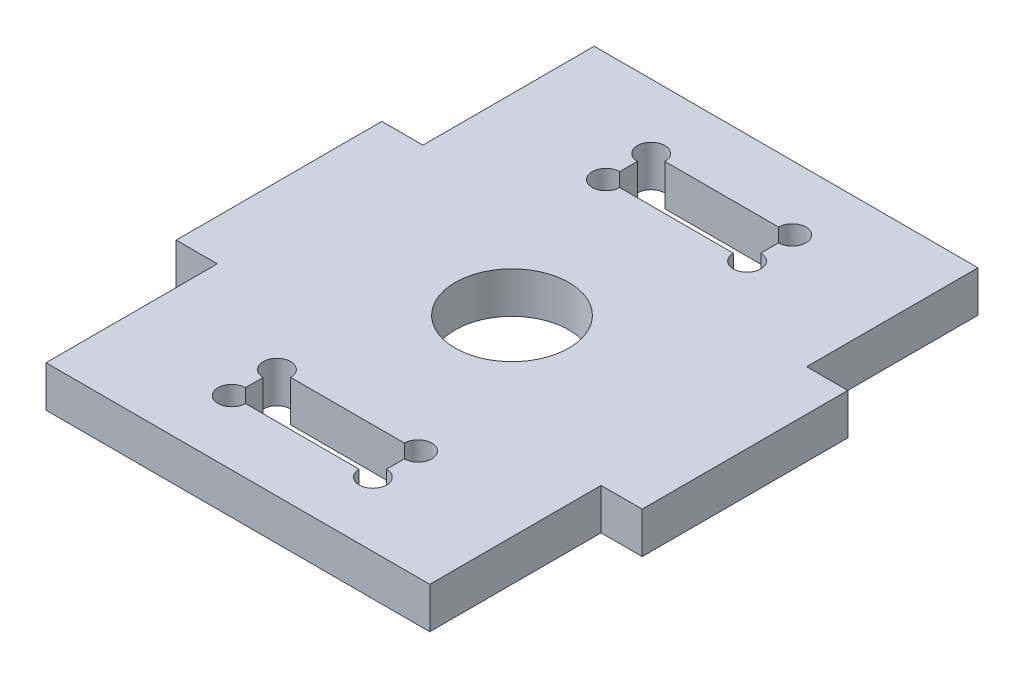
ISO-10303-21;
HEADER;
FILE_DESCRIPTION(('STEP AP214'),'2;1');
FILE_NAME('part.step','',(''),(''),'','','');
FILE_SCHEMA(('AUTOMOTIVE_DESIGN { 1 0 10303 214 1 1 1 1 }'));
ENDSEC;
DATA;
#1=APPLICATION_CONTEXT('core data for automotive mechanical design processes');
#2=APPLICATION_PROTOCOL_DEFINITION('international standard','automotive_design',2000,#1);
#3=PRODUCT_CONTEXT('',#1,'mechanical');
#4=PRODUCT('Part','Part','',(#3));
#5=PRODUCT_RELATED_PRODUCT_CATEGORY('part','',(#4));
#6=PRODUCT_DEFINITION_FORMATION('','',#4);
#7=PRODUCT_DEFINITION_CONTEXT('part definition',#1,'design');
#8=PRODUCT_DEFINITION('design','',#6,#7);
#9=PRODUCT_DEFINITION_SHAPE('','',#8);
#10=(LENGTH_UNIT() NAMED_UNIT(*) SI_UNIT(.MILLI.,.METRE.));
#11=(NAMED_UNIT(*) PLANE_ANGLE_UNIT() SI_UNIT($,.RADIAN.));
#12=(NAMED_UNIT(*) SI_UNIT($,.STERADIAN.) SOLID_ANGLE_UNIT());
#13=UNCERTAINTY_MEASURE_WITH_UNIT(LENGTH_MEASURE(1.E-05),#10,'distance_accuracy_value','');
#14=(GEOMETRIC_REPRESENTATION_CONTEXT(3) GLOBAL_UNCERTAINTY_ASSIGNED_CONTEXT((#13)) GLOBAL_UNIT_ASSIGNED_CONTEXT((#10,
#11,#12)) REPRESENTATION_CONTEXT('',''));
#15=CARTESIAN_POINT('',(0.,0.,0.));
#16=DIRECTION('',(0.,0.,1.));
#17=DIRECTION('',(1.,0.,0.));
#18=AXIS2_PLACEMENT_3D('',#15,#16,#17);
#19=CARTESIAN_POINT('',(0.,3.,15.3));
#20=DIRECTION('',(0.,0.,-1.));
#21=DIRECTION('',(-1.,0.,0.));
#22=AXIS2_PLACEMENT_3D('',#19,#20,#21);
#23=PLANE('',#22);
#24=DIRECTION('',(1.,0.,0.));
#25=VECTOR('',#24,1.);
#26=CARTESIAN_POINT('',(0.,0.,15.3));
#27=LINE('',#26,#25);
#28=CARTESIAN_POINT('',(-4.15,0.,15.3));
#29=VERTEX_POINT('',#28);
#30=CARTESIAN_POINT('',(4.15,0.,15.3));
#31=VERTEX_POINT('',#30);
#32=EDGE_CURVE('E343',#29,#31,#27,.T.);
#33=ORIENTED_EDGE('',*,*,#32,.F.);
#34=DIRECTION('',(0.,-1.,0.));
#35=VECTOR('',#34,1.);
#36=CARTESIAN_POINT('',(-4.15,3.,15.3));
#37=LINE('',#36,#35);
#38=CARTESIAN_POINT('',(-4.15,3.,15.3));
#39=VERTEX_POINT('',#38);
#40=EDGE_CURVE('E12',#39,#29,#37,.T.);
#41=ORIENTED_EDGE('',*,*,#40,.F.);
#42=DIRECTION('',(1.,0.,0.));
#43=VECTOR('',#42,1.);
#44=CARTESIAN_POINT('',(0.,3.,15.3));
#45=LINE('',#44,#43);
#46=CARTESIAN_POINT('',(4.15,3.,15.3));
#47=VERTEX_POINT('',#46);
#48=EDGE_CURVE('E555',#39,#47,#45,.T.);
#49=ORIENTED_EDGE('',*,*,#48,.T.);
#50=DIRECTION('',(0.,-1.,0.));
#51=VECTOR('',#50,1.);
#52=CARTESIAN_POINT('',(4.15,3.,15.3));
#53=LINE('',#52,#51);
#54=EDGE_CURVE('E162',#47,#31,#53,.T.);
#55=ORIENTED_EDGE('',*,*,#54,.T.);
#56=EDGE_LOOP('',(#33,#41,#49,#55));
#57=FACE_BOUND('',#56,.T.);
#58=ADVANCED_FACE('F48',(#57),#23,.T.);
#59=CARTESIAN_POINT('',(-5.15,3.,15.3));
#60=DIRECTION('',(0.,-1.,0.));
#61=DIRECTION('',(0.,0.,-1.));
#62=AXIS2_PLACEMENT_3D('',#59,#60,#61);
#63=CYLINDRICAL_SURFACE('',#62,1.);
#64=CARTESIAN_POINT('',(-5.15,0.,15.3));
#65=DIRECTION('',(0.,1.,0.));
#66=DIRECTION('',(0.,0.,1.));
#67=AXIS2_PLACEMENT_3D('',#64,#65,#66);
#68=CIRCLE('',#67,1.);
#69=CARTESIAN_POINT('',(-5.15,0.,14.3));
#70=VERTEX_POINT('',#69);
#71=EDGE_CURVE('E348',#29,#70,#68,.F.);
#72=ORIENTED_EDGE('',*,*,#71,.T.);
#73=DIRECTION('',(0.,-1.,0.));
#74=VECTOR('',#73,1.);
#75=CARTESIAN_POINT('',(-5.15,3.,14.3));
#76=LINE('',#75,#74);
#77=CARTESIAN_POINT('',(-5.15,3.,14.3));
#78=VERTEX_POINT('',#77);
#79=EDGE_CURVE('E59',#78,#70,#76,.T.);
#80=ORIENTED_EDGE('',*,*,#79,.F.);
#81=CARTESIAN_POINT('',(-5.15,3.,15.3));
#82=DIRECTION('',(0.,1.,0.));
#83=DIRECTION('',(0.,0.,1.));
#84=AXIS2_PLACEMENT_3D('',#81,#82,#83);
#85=CIRCLE('',#84,1.);
#86=EDGE_CURVE('E558',#39,#78,#85,.F.);
#87=ORIENTED_EDGE('',*,*,#86,.F.);
#88=ORIENTED_EDGE('',*,*,#40,.T.);
#89=EDGE_LOOP('',(#72,#80,#87,#88));
#90=FACE_BOUND('',#89,.T.);
#91=ADVANCED_FACE('F656',(#90),#63,.F.);
#92=CARTESIAN_POINT('',(-5.15,3.,0.));
#93=DIRECTION('',(-1.,0.,0.));
#94=DIRECTION('',(0.,0.,1.));
#95=AXIS2_PLACEMENT_3D('',#92,#93,#94);
#96=PLANE('',#95);
#97=DIRECTION('',(0.,0.,-1.));
#98=VECTOR('',#97,1.);
#99=CARTESIAN_POINT('',(-5.15,0.,0.));
#100=LINE('',#99,#98);
#101=CARTESIAN_POINT('',(-5.15,0.,13.));
#102=VERTEX_POINT('',#101);
#103=EDGE_CURVE('E995',#70,#102,#100,.T.);
#104=ORIENTED_EDGE('',*,*,#103,.T.);
#105=DIRECTION('',(0.,-1.,0.));
#106=VECTOR('',#105,1.);
#107=CARTESIAN_POINT('',(-5.15,3.,13.));
#108=LINE('',#107,#106);
#109=CARTESIAN_POINT('',(-5.15,3.,13.));
#110=VERTEX_POINT('',#109);
#111=EDGE_CURVE('E375',#110,#102,#108,.T.);
#112=ORIENTED_EDGE('',*,*,#111,.F.);
#113=DIRECTION('',(0.,0.,-1.));
#114=VECTOR('',#113,1.);
#115=CARTESIAN_POINT('',(-5.15,3.,0.));
#116=LINE('',#115,#114);
#117=EDGE_CURVE('E562',#78,#110,#116,.T.);
#118=ORIENTED_EDGE('',*,*,#117,.F.);
#119=ORIENTED_EDGE('',*,*,#79,.T.);
#120=EDGE_LOOP('',(#104,#112,#118,#119));
#121=FACE_BOUND('',#120,.T.);
#122=ADVANCED_FACE('F661',(#121),#96,.F.);
#123=CARTESIAN_POINT('',(-5.15,3.,12.));
#124=DIRECTION('',(0.,-1.,0.));
#125=DIRECTION('',(0.,0.,-1.));
#126=AXIS2_PLACEMENT_3D('',#123,#124,#125);
#127=CYLINDRICAL_SURFACE('',#126,1.);
#128=CARTESIAN_POINT('',(-5.15,0.,12.));
#129=DIRECTION('',(0.,1.,0.));
#130=DIRECTION('',(0.,0.,1.));
#131=AXIS2_PLACEMENT_3D('',#128,#129,#130);
#132=CIRCLE('',#131,1.);
#133=CARTESIAN_POINT('',(-4.15,0.,12.));
#134=VERTEX_POINT('',#133);
#135=EDGE_CURVE('E1000',#102,#134,#132,.F.);
#136=ORIENTED_EDGE('',*,*,#135,.T.);
#137=DIRECTION('',(0.,-1.,0.));
#138=VECTOR('',#137,1.);
#139=CARTESIAN_POINT('',(-4.15,3.,12.));
#140=LINE('',#139,#138);
#141=CARTESIAN_POINT('',(-4.15,3.,12.));
#142=VERTEX_POINT('',#141);
#143=EDGE_CURVE('E371',#142,#134,#140,.T.);
#144=ORIENTED_EDGE('',*,*,#143,.F.);
#145=CARTESIAN_POINT('',(-5.15,3.,12.));
#146=DIRECTION('',(0.,1.,0.));
#147=DIRECTION('',(0.,0.,1.));
#148=AXIS2_PLACEMENT_3D('',#145,#146,#147);
#149=CIRCLE('',#148,1.);
#150=EDGE_CURVE('E566',#110,#142,#149,.F.);
#151=ORIENTED_EDGE('',*,*,#150,.F.);
#152=ORIENTED_EDGE('',*,*,#111,.T.);
#153=EDGE_LOOP('',(#136,#144,#151,#152));
#154=FACE_BOUND('',#153,.T.);
#155=ADVANCED_FACE('F931',(#154),#127,.F.);
#156=CARTESIAN_POINT('',(0.,3.,12.));
#157=DIRECTION('',(0.,0.,-1.));
#158=DIRECTION('',(-1.,0.,0.));
#159=AXIS2_PLACEMENT_3D('',#156,#157,#158);
#160=PLANE('',#159);
#161=DIRECTION('',(1.,0.,0.));
#162=VECTOR('',#161,1.);
#163=CARTESIAN_POINT('',(0.,0.,12.));
#164=LINE('',#163,#162);
#165=CARTESIAN_POINT('',(4.15,0.,12.));
#166=VERTEX_POINT('',#165);
#167=EDGE_CURVE('E1004',#134,#166,#164,.T.);
#168=ORIENTED_EDGE('',*,*,#167,.T.);
#169=DIRECTION('',(0.,-1.,0.));
#170=VECTOR('',#169,1.);
#171=CARTESIAN_POINT('',(4.15,3.,12.));
#172=LINE('',#171,#170);
#173=CARTESIAN_POINT('',(4.15,3.,12.));
#174=VERTEX_POINT('',#173);
#175=EDGE_CURVE('E263',#174,#166,#172,.T.);
#176=ORIENTED_EDGE('',*,*,#175,.F.);
#177=DIRECTION('',(1.,0.,0.));
#178=VECTOR('',#177,1.);
#179=CARTESIAN_POINT('',(0.,3.,12.));
#180=LINE('',#179,#178);
#181=EDGE_CURVE('E249',#142,#174,#180,.T.);
#182=ORIENTED_EDGE('',*,*,#181,.F.);
#183=ORIENTED_EDGE('',*,*,#143,.T.);
#184=EDGE_LOOP('',(#168,#176,#182,#183));
#185=FACE_BOUND('',#184,.T.);
#186=ADVANCED_FACE('F921',(#185),#160,.F.);
#187=CARTESIAN_POINT('',(5.15,3.,12.));
#188=DIRECTION('',(0.,-1.,0.));
#189=DIRECTION('',(0.,0.,-1.));
#190=AXIS2_PLACEMENT_3D('',#187,#188,#189);
#191=CYLINDRICAL_SURFACE('',#190,1.);
#192=CARTESIAN_POINT('',(5.15,0.,12.));
#193=DIRECTION('',(0.,1.,0.));
#194=DIRECTION('',(0.,0.,1.));
#195=AXIS2_PLACEMENT_3D('',#192,#193,#194);
#196=CIRCLE('',#195,1.);
#197=CARTESIAN_POINT('',(5.15,0.,13.));
#198=VERTEX_POINT('',#197);
#199=EDGE_CURVE('E258',#166,#198,#196,.F.);
#200=ORIENTED_EDGE('',*,*,#199,.T.);
#201=DIRECTION('',(0.,-1.,0.));
#202=VECTOR('',#201,1.);
#203=CARTESIAN_POINT('',(5.15,3.,13.));
#204=LINE('',#203,#202);
#205=CARTESIAN_POINT('',(5.15,3.,13.));
#206=VERTEX_POINT('',#205);
#207=EDGE_CURVE('E256',#206,#198,#204,.T.);
#208=ORIENTED_EDGE('',*,*,#207,.F.);
#209=CARTESIAN_POINT('',(5.15,3.,12.));
#210=DIRECTION('',(0.,1.,0.));
#211=DIRECTION('',(0.,0.,1.));
#212=AXIS2_PLACEMENT_3D('',#209,#210,#211);
#213=CIRCLE('',#212,1.);
#214=EDGE_CURVE('E243',#174,#206,#213,.F.);
#215=ORIENTED_EDGE('',*,*,#214,.F.);
#216=ORIENTED_EDGE('',*,*,#175,.T.);
#217=EDGE_LOOP('',(#200,#208,#215,#216));
#218=FACE_BOUND('',#217,.T.);
#219=ADVANCED_FACE('F257',(#218),#191,.F.);
#220=CARTESIAN_POINT('',(5.15,3.,0.));
#221=DIRECTION('',(-1.,0.,0.));
#222=DIRECTION('',(0.,0.,1.));
#223=AXIS2_PLACEMENT_3D('',#220,#221,#222);
#224=PLANE('',#223);
#225=DIRECTION('',(0.,0.,-1.));
#226=VECTOR('',#225,1.);
#227=CARTESIAN_POINT('',(5.15,0.,0.));
#228=LINE('',#227,#226);
#229=CARTESIAN_POINT('',(5.15,0.,14.3));
#230=VERTEX_POINT('',#229);
#231=EDGE_CURVE('E355',#230,#198,#228,.T.);
#232=ORIENTED_EDGE('',*,*,#231,.F.);
#233=DIRECTION('',(0.,-1.,0.));
#234=VECTOR('',#233,1.);
#235=CARTESIAN_POINT('',(5.15,3.,14.3));
#236=LINE('',#235,#234);
#237=CARTESIAN_POINT('',(5.15,3.,14.3));
#238=VERTEX_POINT('',#237);
#239=EDGE_CURVE('E155',#238,#230,#236,.T.);
#240=ORIENTED_EDGE('',*,*,#239,.F.);
#241=DIRECTION('',(0.,0.,-1.));
#242=VECTOR('',#241,1.);
#243=CARTESIAN_POINT('',(5.15,3.,0.));
#244=LINE('',#243,#242);
#245=EDGE_CURVE('E247',#238,#206,#244,.T.);
#246=ORIENTED_EDGE('',*,*,#245,.T.);
#247=ORIENTED_EDGE('',*,*,#207,.T.);
#248=EDGE_LOOP('',(#232,#240,#246,#247));
#249=FACE_BOUND('',#248,.T.);
#250=ADVANCED_FACE('F265',(#249),#224,.T.);
#251=CARTESIAN_POINT('',(14.,3.,0.));
#252=DIRECTION('',(1.,0.,0.));
#253=DIRECTION('',(0.,0.,-1.));
#254=AXIS2_PLACEMENT_3D('',#251,#252,#253);
#255=PLANE('',#254);
#256=DIRECTION('',(0.,0.,1.));
#257=VECTOR('',#256,1.);
#258=CARTESIAN_POINT('',(14.,0.,0.));
#259=LINE('',#258,#257);
#260=CARTESIAN_POINT('',(14.,0.,-20.));
#261=VERTEX_POINT('',#260);
#262=CARTESIAN_POINT('',(14.,0.,-7.5));
#263=VERTEX_POINT('',#262);
#264=EDGE_CURVE('E295',#261,#263,#259,.T.);
#265=ORIENTED_EDGE('',*,*,#264,.F.);
#266=DIRECTION('',(0.,-1.,0.));
#267=VECTOR('',#266,1.);
#268=CARTESIAN_POINT('',(14.,3.,-20.));
#269=LINE('',#268,#267);
#270=CARTESIAN_POINT('',(14.,3.,-20.));
#271=VERTEX_POINT('',#270);
#272=EDGE_CURVE('E366',#271,#261,#269,.T.);
#273=ORIENTED_EDGE('',*,*,#272,.F.);
#274=DIRECTION('',(0.,0.,1.));
#275=VECTOR('',#274,1.);
#276=CARTESIAN_POINT('',(14.,3.,0.));
#277=LINE('',#276,#275);
#278=CARTESIAN_POINT('',(14.,3.,-7.5));
#279=VERTEX_POINT('',#278);
#280=EDGE_CURVE('E516',#271,#279,#277,.T.);
#281=ORIENTED_EDGE('',*,*,#280,.T.);
#282=DIRECTION('',(0.,-1.,0.));
#283=VECTOR('',#282,1.);
#284=CARTESIAN_POINT('',(14.,3.,-7.5));
#285=LINE('',#284,#283);
#286=EDGE_CURVE('E382',#279,#263,#285,.T.);
#287=ORIENTED_EDGE('',*,*,#286,.T.);
#288=EDGE_LOOP('',(#265,#273,#281,#287));
#289=FACE_BOUND('',#288,.T.);
#290=ADVANCED_FACE('F643',(#289),#255,.T.);
#291=CARTESIAN_POINT('',(0.,3.,-20.));
#292=DIRECTION('',(0.,0.,-1.));
#293=DIRECTION('',(-1.,0.,0.));
#294=AXIS2_PLACEMENT_3D('',#291,#292,#293);
#295=PLANE('',#294);
#296=DIRECTION('',(1.,0.,0.));
#297=VECTOR('',#296,1.);
#298=CARTESIAN_POINT('',(0.,0.,-20.));
#299=LINE('',#298,#297);
#300=CARTESIAN_POINT('',(-14.,0.,-20.));
#301=VERTEX_POINT('',#300);
#302=EDGE_CURVE('E303',#301,#261,#299,.T.);
#303=ORIENTED_EDGE('',*,*,#302,.F.);
#304=DIRECTION('',(0.,-1.,0.));
#305=VECTOR('',#304,1.);
#306=CARTESIAN_POINT('',(-14.,3.,-20.));
#307=LINE('',#306,#305);
#308=CARTESIAN_POINT('',(-14.,3.,-20.));
#309=VERTEX_POINT('',#308);
#310=EDGE_CURVE('E415',#309,#301,#307,.T.);
#311=ORIENTED_EDGE('',*,*,#310,.F.);
#312=DIRECTION('',(1.,0.,0.));
#313=VECTOR('',#312,1.);
#314=CARTESIAN_POINT('',(0.,3.,-20.));
#315=LINE('',#314,#313);
#316=EDGE_CURVE('E520',#309,#271,#315,.T.);
#317=ORIENTED_EDGE('',*,*,#316,.T.);
#318=ORIENTED_EDGE('',*,*,#272,.T.);
#319=EDGE_LOOP('',(#303,#311,#317,#318));
#320=FACE_BOUND('',#319,.T.);
#321=ADVANCED_FACE('F606',(#320),#295,.T.);
#322=CARTESIAN_POINT('',(-14.,3.,0.));
#323=DIRECTION('',(1.,0.,0.));
#324=DIRECTION('',(0.,0.,-1.));
#325=AXIS2_PLACEMENT_3D('',#322,#323,#324);
#326=PLANE('',#325);
#327=DIRECTION('',(0.,0.,1.));
#328=VECTOR('',#327,1.);
#329=CARTESIAN_POINT('',(-14.,0.,0.));
#330=LINE('',#329,#328);
#331=CARTESIAN_POINT('',(-14.,0.,-7.5));
#332=VERTEX_POINT('',#331);
#333=EDGE_CURVE('E631',#301,#332,#330,.T.);
#334=ORIENTED_EDGE('',*,*,#333,.T.);
#335=DIRECTION('',(0.,-1.,0.));
#336=VECTOR('',#335,1.);
#337=CARTESIAN_POINT('',(-14.,3.,-7.5));
#338=LINE('',#337,#336);
#339=CARTESIAN_POINT('',(-14.,3.,-7.5));
#340=VERTEX_POINT('',#339);
#341=EDGE_CURVE('E411',#340,#332,#338,.T.);
#342=ORIENTED_EDGE('',*,*,#341,.F.);
#343=DIRECTION('',(0.,0.,1.));
#344=VECTOR('',#343,1.);
#345=CARTESIAN_POINT('',(-14.,3.,0.));
#346=LINE('',#345,#344);
#347=EDGE_CURVE('E525',#309,#340,#346,.T.);
#348=ORIENTED_EDGE('',*,*,#347,.F.);
#349=ORIENTED_EDGE('',*,*,#310,.T.);
#350=EDGE_LOOP('',(#334,#342,#348,#349));
#351=FACE_BOUND('',#350,.T.);
#352=ADVANCED_FACE('F614',(#351),#326,.F.);
#353=CARTESIAN_POINT('',(0.,3.,-7.5));
#354=DIRECTION('',(0.,0.,1.));
#355=DIRECTION('',(1.,0.,0.));
#356=AXIS2_PLACEMENT_3D('',#353,#354,#355);
#357=PLANE('',#356);
#358=DIRECTION('',(-1.,0.,0.));
#359=VECTOR('',#358,1.);
#360=CARTESIAN_POINT('',(0.,0.,-7.5));
#361=LINE('',#360,#359);
#362=CARTESIAN_POINT('',(-17.,0.,-7.5));
#363=VERTEX_POINT('',#362);
#364=EDGE_CURVE('E619',#332,#363,#361,.T.);
#365=ORIENTED_EDGE('',*,*,#364,.T.);
#366=DIRECTION('',(0.,-1.,0.));
#367=VECTOR('',#366,1.);
#368=CARTESIAN_POINT('',(-17.,3.,-7.5));
#369=LINE('',#368,#367);
#370=CARTESIAN_POINT('',(-17.,3.,-7.5));
#371=VERTEX_POINT('',#370);
#372=EDGE_CURVE('E408',#371,#363,#369,.T.);
#373=ORIENTED_EDGE('',*,*,#372,.F.);
#374=DIRECTION('',(-1.,0.,0.));
#375=VECTOR('',#374,1.);
#376=CARTESIAN_POINT('',(0.,3.,-7.5));
#377=LINE('',#376,#375);
#378=EDGE_CURVE('E529',#340,#371,#377,.T.);
#379=ORIENTED_EDGE('',*,*,#378,.F.);
#380=ORIENTED_EDGE('',*,*,#341,.T.);
#381=EDGE_LOOP('',(#365,#373,#379,#380));
#382=FACE_BOUND('',#381,.T.);
#383=ADVANCED_FACE('F618',(#382),#357,.F.);
#384=CARTESIAN_POINT('',(-17.,3.,0.));
#385=DIRECTION('',(-1.,0.,0.));
#386=DIRECTION('',(0.,0.,1.));
#387=AXIS2_PLACEMENT_3D('',#384,#385,#386);
#388=PLANE('',#387);
#389=DIRECTION('',(0.,0.,-1.));
#390=VECTOR('',#389,1.);
#391=CARTESIAN_POINT('',(-17.,0.,0.));
#392=LINE('',#391,#390);
#393=CARTESIAN_POINT('',(-17.,0.,7.5));
#394=VERTEX_POINT('',#393);
#395=EDGE_CURVE('E624',#394,#363,#392,.T.);
#396=ORIENTED_EDGE('',*,*,#395,.F.);
#397=DIRECTION('',(0.,-1.,0.));
#398=VECTOR('',#397,1.);
#399=CARTESIAN_POINT('',(-17.,3.,7.5));
#400=LINE('',#399,#398);
#401=CARTESIAN_POINT('',(-17.,3.,7.5));
#402=VERTEX_POINT('',#401);
#403=EDGE_CURVE('E405',#402,#394,#400,.T.);
#404=ORIENTED_EDGE('',*,*,#403,.F.);
#405=DIRECTION('',(0.,0.,-1.));
#406=VECTOR('',#405,1.);
#407=CARTESIAN_POINT('',(-17.,3.,0.));
#408=LINE('',#407,#406);
#409=EDGE_CURVE('E533',#402,#371,#408,.T.);
#410=ORIENTED_EDGE('',*,*,#409,.T.);
#411=ORIENTED_EDGE('',*,*,#372,.T.);
#412=EDGE_LOOP('',(#396,#404,#410,#411));
#413=FACE_BOUND('',#412,.T.);
#414=ADVANCED_FACE('F623',(#413),#388,.T.);
#415=CARTESIAN_POINT('',(0.,3.,7.49999999999999));
#416=DIRECTION('',(0.,0.,1.));
#417=DIRECTION('',(1.,0.,0.));
#418=AXIS2_PLACEMENT_3D('',#415,#416,#417);
#419=PLANE('',#418);
#420=DIRECTION('',(-1.,0.,0.));
#421=VECTOR('',#420,1.);
#422=CARTESIAN_POINT('',(0.,0.,7.49999999999999));
#423=LINE('',#422,#421);
#424=CARTESIAN_POINT('',(-14.,0.,7.5));
#425=VERTEX_POINT('',#424);
#426=EDGE_CURVE('E325',#425,#394,#423,.T.);
#427=ORIENTED_EDGE('',*,*,#426,.F.);
#428=DIRECTION('',(0.,-1.,0.));
#429=VECTOR('',#428,1.);
#430=CARTESIAN_POINT('',(-14.,3.,7.5));
#431=LINE('',#430,#429);
#432=CARTESIAN_POINT('',(-14.,3.,7.5));
#433=VERTEX_POINT('',#432);
#434=EDGE_CURVE('E402',#433,#425,#431,.T.);
#435=ORIENTED_EDGE('',*,*,#434,.F.);
#436=DIRECTION('',(-1.,0.,0.));
#437=VECTOR('',#436,1.);
#438=CARTESIAN_POINT('',(0.,3.,7.49999999999999));
#439=LINE('',#438,#437);
#440=EDGE_CURVE('E537',#433,#402,#439,.T.);
#441=ORIENTED_EDGE('',*,*,#440,.T.);
#442=ORIENTED_EDGE('',*,*,#403,.T.);
#443=EDGE_LOOP('',(#427,#435,#441,#442));
#444=FACE_BOUND('',#443,.T.);
#445=ADVANCED_FACE('F628',(#444),#419,.T.);
#446=CARTESIAN_POINT('',(-14.,0.,20.));
#447=VERTEX_POINT('',#446);
#448=EDGE_CURVE('E324',#425,#447,#330,.T.);
#449=ORIENTED_EDGE('',*,*,#448,.T.);
#450=DIRECTION('',(0.,-1.,0.));
#451=VECTOR('',#450,1.);
#452=CARTESIAN_POINT('',(-14.,3.,20.));
#453=LINE('',#452,#451);
#454=CARTESIAN_POINT('',(-14.,3.,20.));
#455=VERTEX_POINT('',#454);
#456=EDGE_CURVE('E398',#455,#447,#453,.T.);
#457=ORIENTED_EDGE('',*,*,#456,.F.);
#458=EDGE_CURVE('E530',#433,#455,#346,.T.);
#459=ORIENTED_EDGE('',*,*,#458,.F.);
#460=ORIENTED_EDGE('',*,*,#434,.T.);
#461=EDGE_LOOP('',(#449,#457,#459,#460));
#462=FACE_BOUND('',#461,.T.);
#463=ADVANCED_FACE('F582',(#462),#326,.F.);
#464=CARTESIAN_POINT('',(0.,3.,20.));
#465=DIRECTION('',(0.,0.,-1.));
#466=DIRECTION('',(-1.,0.,0.));
#467=AXIS2_PLACEMENT_3D('',#464,#465,#466);
#468=PLANE('',#467);
#469=DIRECTION('',(1.,0.,0.));
#470=VECTOR('',#469,1.);
#471=CARTESIAN_POINT('',(0.,0.,20.));
#472=LINE('',#471,#470);
#473=CARTESIAN_POINT('',(14.,0.,20.));
#474=VERTEX_POINT('',#473);
#475=EDGE_CURVE('E319',#447,#474,#472,.T.);
#476=ORIENTED_EDGE('',*,*,#475,.T.);
#477=DIRECTION('',(0.,-1.,0.));
#478=VECTOR('',#477,1.);
#479=CARTESIAN_POINT('',(14.,3.,20.));
#480=LINE('',#479,#478);
#481=CARTESIAN_POINT('',(14.,3.,20.));
#482=VERTEX_POINT('',#481);
#483=EDGE_CURVE('E395',#482,#474,#480,.T.);
#484=ORIENTED_EDGE('',*,*,#483,.F.);
#485=DIRECTION('',(1.,0.,0.));
#486=VECTOR('',#485,1.);
#487=CARTESIAN_POINT('',(0.,3.,20.));
#488=LINE('',#487,#486);
#489=EDGE_CURVE('E541',#455,#482,#488,.T.);
#490=ORIENTED_EDGE('',*,*,#489,.F.);
#491=ORIENTED_EDGE('',*,*,#456,.T.);
#492=EDGE_LOOP('',(#476,#484,#490,#491));
#493=FACE_BOUND('',#492,.T.);
#494=ADVANCED_FACE('F585',(#493),#468,.F.);
#495=CARTESIAN_POINT('',(14.,0.,7.5));
#496=VERTEX_POINT('',#495);
#497=EDGE_CURVE('E304',#496,#474,#259,.T.);
#498=ORIENTED_EDGE('',*,*,#497,.F.);
#499=DIRECTION('',(0.,-1.,0.));
#500=VECTOR('',#499,1.);
#501=CARTESIAN_POINT('',(14.,3.,7.5));
#502=LINE('',#501,#500);
#503=CARTESIAN_POINT('',(14.,3.,7.5));
#504=VERTEX_POINT('',#503);
#505=EDGE_CURVE('E392',#504,#496,#502,.T.);
#506=ORIENTED_EDGE('',*,*,#505,.F.);
#507=EDGE_CURVE('E521',#504,#482,#277,.T.);
#508=ORIENTED_EDGE('',*,*,#507,.T.);
#509=ORIENTED_EDGE('',*,*,#483,.T.);
#510=EDGE_LOOP('',(#498,#506,#508,#509));
#511=FACE_BOUND('',#510,.T.);
#512=ADVANCED_FACE('F589',(#511),#255,.T.);
#513=CARTESIAN_POINT('',(0.,3.,7.5));
#514=DIRECTION('',(0.,0.,-1.));
#515=DIRECTION('',(-1.,0.,0.));
#516=AXIS2_PLACEMENT_3D('',#513,#514,#515);
#517=PLANE('',#516);
#518=DIRECTION('',(1.,0.,0.));
#519=VECTOR('',#518,1.);
#520=CARTESIAN_POINT('',(0.,0.,7.5));
#521=LINE('',#520,#519);
#522=CARTESIAN_POINT('',(17.,0.,7.5));
#523=VERTEX_POINT('',#522);
#524=EDGE_CURVE('E328',#496,#523,#521,.T.);
#525=ORIENTED_EDGE('',*,*,#524,.T.);
#526=DIRECTION('',(0.,-1.,0.));
#527=VECTOR('',#526,1.);
#528=CARTESIAN_POINT('',(17.,3.,7.5));
#529=LINE('',#528,#527);
#530=CARTESIAN_POINT('',(17.,3.,7.5));
#531=VERTEX_POINT('',#530);
#532=EDGE_CURVE('E388',#531,#523,#529,.T.);
#533=ORIENTED_EDGE('',*,*,#532,.F.);
#534=DIRECTION('',(1.,0.,0.));
#535=VECTOR('',#534,1.);
#536=CARTESIAN_POINT('',(0.,3.,7.5));
#537=LINE('',#536,#535);
#538=EDGE_CURVE('E544',#504,#531,#537,.T.);
#539=ORIENTED_EDGE('',*,*,#538,.F.);
#540=ORIENTED_EDGE('',*,*,#505,.T.);
#541=EDGE_LOOP('',(#525,#533,#539,#540));
#542=FACE_BOUND('',#541,.T.);
#543=ADVANCED_FACE('F595',(#542),#517,.F.);
#544=CARTESIAN_POINT('',(17.,3.,0.));
#545=DIRECTION('',(-1.,0.,0.));
#546=DIRECTION('',(0.,0.,1.));
#547=AXIS2_PLACEMENT_3D('',#544,#545,#546);
#548=PLANE('',#547);
#549=DIRECTION('',(0.,0.,-1.));
#550=VECTOR('',#549,1.);
#551=CARTESIAN_POINT('',(17.,0.,0.));
#552=LINE('',#551,#550);
#553=CARTESIAN_POINT('',(17.,0.,-7.5));
#554=VERTEX_POINT('',#553);
#555=EDGE_CURVE('E333',#523,#554,#552,.T.);
#556=ORIENTED_EDGE('',*,*,#555,.T.);
#557=DIRECTION('',(0.,-1.,0.));
#558=VECTOR('',#557,1.);
#559=CARTESIAN_POINT('',(17.,3.,-7.5));
#560=LINE('',#559,#558);
#561=CARTESIAN_POINT('',(17.,3.,-7.5));
#562=VERTEX_POINT('',#561);
#563=EDGE_CURVE('E385',#562,#554,#560,.T.);
#564=ORIENTED_EDGE('',*,*,#563,.F.);
#565=DIRECTION('',(0.,0.,-1.));
#566=VECTOR('',#565,1.);
#567=CARTESIAN_POINT('',(17.,3.,0.));
#568=LINE('',#567,#566);
#569=EDGE_CURVE('E548',#531,#562,#568,.T.);
#570=ORIENTED_EDGE('',*,*,#569,.F.);
#571=ORIENTED_EDGE('',*,*,#532,.T.);
#572=EDGE_LOOP('',(#556,#564,#570,#571));
#573=FACE_BOUND('',#572,.T.);
#574=ADVANCED_FACE('F598',(#573),#548,.F.);
#575=CARTESIAN_POINT('',(-5.15,3.,-12.));
#576=DIRECTION('',(0.,-1.,0.));
#577=DIRECTION('',(0.,0.,-1.));
#578=AXIS2_PLACEMENT_3D('',#575,#576,#577);
#579=CYLINDRICAL_SURFACE('',#578,1.);
#580=CARTESIAN_POINT('',(-5.15,0.,-12.));
#581=DIRECTION('',(0.,1.,0.));
#582=DIRECTION('',(0.,0.,1.));
#583=AXIS2_PLACEMENT_3D('',#580,#581,#582);
#584=CIRCLE('',#583,1.);
#585=CARTESIAN_POINT('',(-5.15,0.,-13.));
#586=VERTEX_POINT('',#585);
#587=CARTESIAN_POINT('',(-4.15,0.,-12.));
#588=VERTEX_POINT('',#587);
#589=EDGE_CURVE('E273',#586,#588,#584,.T.);
#590=ORIENTED_EDGE('',*,*,#589,.F.);
#591=DIRECTION('',(0.,-1.,0.));
#592=VECTOR('',#591,1.);
#593=CARTESIAN_POINT('',(-5.15,3.,-13.));
#594=LINE('',#593,#592);
#595=CARTESIAN_POINT('',(-5.15,3.,-13.));
#596=VERTEX_POINT('',#595);
#597=EDGE_CURVE('E52',#596,#586,#594,.T.);
#598=ORIENTED_EDGE('',*,*,#597,.F.);
#599=CARTESIAN_POINT('',(-5.15,3.,-12.));
#600=DIRECTION('',(0.,1.,0.));
#601=DIRECTION('',(0.,0.,1.));
#602=AXIS2_PLACEMENT_3D('',#599,#600,#601);
#603=CIRCLE('',#602,1.);
#604=CARTESIAN_POINT('',(-4.15,3.,-12.));
#605=VERTEX_POINT('',#604);
#606=EDGE_CURVE('E363',#596,#605,#603,.T.);
#607=ORIENTED_EDGE('',*,*,#606,.T.);
#608=DIRECTION('',(0.,-1.,0.));
#609=VECTOR('',#608,1.);
#610=CARTESIAN_POINT('',(-4.15,3.,-12.));
#611=LINE('',#610,#609);
#612=EDGE_CURVE('E269',#605,#588,#611,.T.);
#613=ORIENTED_EDGE('',*,*,#612,.T.);
#614=EDGE_LOOP('',(#590,#598,#607,#613));
#615=FACE_BOUND('',#614,.T.);
#616=ADVANCED_FACE('F50',(#615),#579,.F.);
#617=CARTESIAN_POINT('',(-5.15,3.,0.));
#618=DIRECTION('',(1.,0.,0.));
#619=DIRECTION('',(0.,0.,-1.));
#620=AXIS2_PLACEMENT_3D('',#617,#618,#619);
#621=PLANE('',#620);
#622=DIRECTION('',(0.,0.,1.));
#623=VECTOR('',#622,1.);
#624=CARTESIAN_POINT('',(-5.15,0.,0.));
#625=LINE('',#624,#623);
#626=CARTESIAN_POINT('',(-5.15,0.,-14.3));
#627=VERTEX_POINT('',#626);
#628=EDGE_CURVE('E278',#627,#586,#625,.T.);
#629=ORIENTED_EDGE('',*,*,#628,.F.);
#630=DIRECTION('',(0.,-1.,0.));
#631=VECTOR('',#630,1.);
#632=CARTESIAN_POINT('',(-5.15,3.,-14.3));
#633=LINE('',#632,#631);
#634=CARTESIAN_POINT('',(-5.15,3.,-14.3));
#635=VERTEX_POINT('',#634);
#636=EDGE_CURVE('E436',#635,#627,#633,.T.);
#637=ORIENTED_EDGE('',*,*,#636,.F.);
#638=DIRECTION('',(0.,0.,1.));
#639=VECTOR('',#638,1.);
#640=CARTESIAN_POINT('',(-5.15,3.,0.));
#641=LINE('',#640,#639);
#642=EDGE_CURVE('E449',#635,#596,#641,.T.);
#643=ORIENTED_EDGE('',*,*,#642,.T.);
#644=ORIENTED_EDGE('',*,*,#597,.T.);
#645=EDGE_LOOP('',(#629,#637,#643,#644));
#646=FACE_BOUND('',#645,.T.);
#647=ADVANCED_FACE('F445',(#646),#621,.T.);
#648=CARTESIAN_POINT('',(-5.15,3.,-15.3));
#649=DIRECTION('',(0.,-1.,0.));
#650=DIRECTION('',(0.,0.,-1.));
#651=AXIS2_PLACEMENT_3D('',#648,#649,#650);
#652=CYLINDRICAL_SURFACE('',#651,1.);
#653=CARTESIAN_POINT('',(-5.15,0.,-15.3));
#654=DIRECTION('',(0.,1.,0.));
#655=DIRECTION('',(0.,0.,1.));
#656=AXIS2_PLACEMENT_3D('',#653,#654,#655);
#657=CIRCLE('',#656,1.);
#658=CARTESIAN_POINT('',(-4.15,0.,-15.3));
#659=VERTEX_POINT('',#658);
#660=EDGE_CURVE('E455',#659,#627,#657,.T.);
#661=ORIENTED_EDGE('',*,*,#660,.F.);
#662=DIRECTION('',(0.,-1.,0.));
#663=VECTOR('',#662,1.);
#664=CARTESIAN_POINT('',(-4.15,3.,-15.3));
#665=LINE('',#664,#663);
#666=CARTESIAN_POINT('',(-4.15,3.,-15.3));
#667=VERTEX_POINT('',#666);
#668=EDGE_CURVE('E434',#667,#659,#665,.T.);
#669=ORIENTED_EDGE('',*,*,#668,.F.);
#670=CARTESIAN_POINT('',(-5.15,3.,-15.3));
#671=DIRECTION('',(0.,1.,0.));
#672=DIRECTION('',(0.,0.,1.));
#673=AXIS2_PLACEMENT_3D('',#670,#671,#672);
#674=CIRCLE('',#673,1.);
#675=EDGE_CURVE('E506',#667,#635,#674,.T.);
#676=ORIENTED_EDGE('',*,*,#675,.T.);
#677=ORIENTED_EDGE('',*,*,#636,.T.);
#678=EDGE_LOOP('',(#661,#669,#676,#677));
#679=FACE_BOUND('',#678,.T.);
#680=ADVANCED_FACE('F691',(#679),#652,.F.);
#681=CARTESIAN_POINT('',(0.,3.,-15.3));
#682=DIRECTION('',(0.,0.,-1.));
#683=DIRECTION('',(-1.,0.,0.));
#684=AXIS2_PLACEMENT_3D('',#681,#682,#683);
#685=PLANE('',#684);
#686=DIRECTION('',(1.,0.,0.));
#687=VECTOR('',#686,1.);
#688=CARTESIAN_POINT('',(0.,0.,-15.3));
#689=LINE('',#688,#687);
#690=CARTESIAN_POINT('',(4.15,0.,-15.3));
#691=VERTEX_POINT('',#690);
#692=EDGE_CURVE('E458',#659,#691,#689,.T.);
#693=ORIENTED_EDGE('',*,*,#692,.T.);
#694=DIRECTION('',(0.,-1.,0.));
#695=VECTOR('',#694,1.);
#696=CARTESIAN_POINT('',(4.15,3.,-15.3));
#697=LINE('',#696,#695);
#698=CARTESIAN_POINT('',(4.15,3.,-15.3));
#699=VERTEX_POINT('',#698);
#700=EDGE_CURVE('E431',#699,#691,#697,.T.);
#701=ORIENTED_EDGE('',*,*,#700,.F.);
#702=DIRECTION('',(1.,0.,0.));
#703=VECTOR('',#702,1.);
#704=CARTESIAN_POINT('',(0.,3.,-15.3));
#705=LINE('',#704,#703);
#706=EDGE_CURVE('E500',#667,#699,#705,.T.);
#707=ORIENTED_EDGE('',*,*,#706,.F.);
#708=ORIENTED_EDGE('',*,*,#668,.T.);
#709=EDGE_LOOP('',(#693,#701,#707,#708));
#710=FACE_BOUND('',#709,.T.);
#711=ADVANCED_FACE('F697',(#710),#685,.F.);
#712=CARTESIAN_POINT('',(5.15,3.,-15.3));
#713=DIRECTION('',(0.,-1.,0.));
#714=DIRECTION('',(0.,0.,-1.));
#715=AXIS2_PLACEMENT_3D('',#712,#713,#714);
#716=CYLINDRICAL_SURFACE('',#715,1.);
#717=CARTESIAN_POINT('',(5.15,0.,-15.3));
#718=DIRECTION('',(0.,1.,0.));
#719=DIRECTION('',(0.,0.,1.));
#720=AXIS2_PLACEMENT_3D('',#717,#718,#719);
#721=CIRCLE('',#720,1.);
#722=CARTESIAN_POINT('',(5.15,0.,-14.3));
#723=VERTEX_POINT('',#722);
#724=EDGE_CURVE('E461',#723,#691,#721,.T.);
#725=ORIENTED_EDGE('',*,*,#724,.F.);
#726=DIRECTION('',(0.,-1.,0.));
#727=VECTOR('',#726,1.);
#728=CARTESIAN_POINT('',(5.15,3.,-14.3));
#729=LINE('',#728,#727);
#730=CARTESIAN_POINT('',(5.15,3.,-14.3));
#731=VERTEX_POINT('',#730);
#732=EDGE_CURVE('E428',#731,#723,#729,.T.);
#733=ORIENTED_EDGE('',*,*,#732,.F.);
#734=CARTESIAN_POINT('',(5.15,3.,-15.3));
#735=DIRECTION('',(0.,1.,0.));
#736=DIRECTION('',(0.,0.,1.));
#737=AXIS2_PLACEMENT_3D('',#734,#735,#736);
#738=CIRCLE('',#737,1.);
#739=EDGE_CURVE('E494',#731,#699,#738,.T.);
#740=ORIENTED_EDGE('',*,*,#739,.T.);
#741=ORIENTED_EDGE('',*,*,#700,.T.);
#742=EDGE_LOOP('',(#725,#733,#740,#741));
#743=FACE_BOUND('',#742,.T.);
#744=ADVANCED_FACE('F704',(#743),#716,.F.);
#745=CARTESIAN_POINT('',(5.15,3.,0.));
#746=DIRECTION('',(1.,0.,0.));
#747=DIRECTION('',(0.,0.,-1.));
#748=AXIS2_PLACEMENT_3D('',#745,#746,#747);
#749=PLANE('',#748);
#750=DIRECTION('',(0.,0.,1.));
#751=VECTOR('',#750,1.);
#752=CARTESIAN_POINT('',(5.15,0.,0.));
#753=LINE('',#752,#751);
#754=CARTESIAN_POINT('',(5.15,0.,-13.));
#755=VERTEX_POINT('',#754);
#756=EDGE_CURVE('E472',#723,#755,#753,.T.);
#757=ORIENTED_EDGE('',*,*,#756,.T.);
#758=DIRECTION('',(0.,-1.,0.));
#759=VECTOR('',#758,1.);
#760=CARTESIAN_POINT('',(5.15,3.,-13.));
#761=LINE('',#760,#759);
#762=CARTESIAN_POINT('',(5.15,3.,-13.));
#763=VERTEX_POINT('',#762);
#764=EDGE_CURVE('E425',#763,#755,#761,.T.);
#765=ORIENTED_EDGE('',*,*,#764,.F.);
#766=DIRECTION('',(0.,0.,1.));
#767=VECTOR('',#766,1.);
#768=CARTESIAN_POINT('',(5.15,3.,0.));
#769=LINE('',#768,#767);
#770=EDGE_CURVE('E490',#731,#763,#769,.T.);
#771=ORIENTED_EDGE('',*,*,#770,.F.);
#772=ORIENTED_EDGE('',*,*,#732,.T.);
#773=EDGE_LOOP('',(#757,#765,#771,#772));
#774=FACE_BOUND('',#773,.T.);
#775=ADVANCED_FACE('F489',(#774),#749,.F.);
#776=CARTESIAN_POINT('',(5.15,3.,-12.));
#777=DIRECTION('',(0.,-1.,0.));
#778=DIRECTION('',(0.,0.,-1.));
#779=AXIS2_PLACEMENT_3D('',#776,#777,#778);
#780=CYLINDRICAL_SURFACE('',#779,1.);
#781=CARTESIAN_POINT('',(5.15,0.,-12.));
#782=DIRECTION('',(0.,1.,0.));
#783=DIRECTION('',(0.,0.,1.));
#784=AXIS2_PLACEMENT_3D('',#781,#782,#783);
#785=CIRCLE('',#784,1.);
#786=CARTESIAN_POINT('',(4.15,0.,-12.));
#787=VERTEX_POINT('',#786);
#788=EDGE_CURVE('E296',#787,#755,#785,.T.);
#789=ORIENTED_EDGE('',*,*,#788,.F.);
#790=DIRECTION('',(0.,-1.,0.));
#791=VECTOR('',#790,1.);
#792=CARTESIAN_POINT('',(4.15,3.,-12.));
#793=LINE('',#792,#791);
#794=CARTESIAN_POINT('',(4.15,3.,-12.));
#795=VERTEX_POINT('',#794);
#796=EDGE_CURVE('E422',#795,#787,#793,.T.);
#797=ORIENTED_EDGE('',*,*,#796,.F.);
#798=CARTESIAN_POINT('',(5.15,3.,-12.));
#799=DIRECTION('',(0.,1.,0.));
#800=DIRECTION('',(0.,0.,1.));
#801=AXIS2_PLACEMENT_3D('',#798,#799,#800);
#802=CIRCLE('',#801,1.);
#803=EDGE_CURVE('E487',#795,#763,#802,.T.);
#804=ORIENTED_EDGE('',*,*,#803,.T.);
#805=ORIENTED_EDGE('',*,*,#764,.T.);
#806=EDGE_LOOP('',(#789,#797,#804,#805));
#807=FACE_BOUND('',#806,.T.);
#808=ADVANCED_FACE('F484',(#807),#780,.F.);
#809=CARTESIAN_POINT('',(0.,3.,-7.5));
#810=DIRECTION('',(0.,0.,-1.));
#811=DIRECTION('',(-1.,0.,0.));
#812=AXIS2_PLACEMENT_3D('',#809,#810,#811);
#813=PLANE('',#812);
#814=DIRECTION('',(1.,0.,0.));
#815=VECTOR('',#814,1.);
#816=CARTESIAN_POINT('',(0.,0.,-7.5));
#817=LINE('',#816,#815);
#818=EDGE_CURVE('E338',#263,#554,#817,.T.);
#819=ORIENTED_EDGE('',*,*,#818,.F.);
#820=ORIENTED_EDGE('',*,*,#286,.F.);
#821=DIRECTION('',(1.,0.,0.));
#822=VECTOR('',#821,1.);
#823=CARTESIAN_POINT('',(0.,3.,-7.5));
#824=LINE('',#823,#822);
#825=EDGE_CURVE('E551',#279,#562,#824,.T.);
#826=ORIENTED_EDGE('',*,*,#825,.T.);
#827=ORIENTED_EDGE('',*,*,#563,.T.);
#828=EDGE_LOOP('',(#819,#820,#826,#827));
#829=FACE_BOUND('',#828,.T.);
#830=ADVANCED_FACE('F601',(#829),#813,.T.);
#831=CARTESIAN_POINT('',(0.,3.,-12.));
#832=DIRECTION('',(0.,0.,-1.));
#833=DIRECTION('',(-1.,0.,0.));
#834=AXIS2_PLACEMENT_3D('',#831,#832,#833);
#835=PLANE('',#834);
#836=DIRECTION('',(1.,0.,0.));
#837=VECTOR('',#836,1.);
#838=CARTESIAN_POINT('',(0.,0.,-12.));
#839=LINE('',#838,#837);
#840=EDGE_CURVE('E290',#588,#787,#839,.T.);
#841=ORIENTED_EDGE('',*,*,#840,.F.);
#842=ORIENTED_EDGE('',*,*,#612,.F.);
#843=DIRECTION('',(1.,0.,0.));
#844=VECTOR('',#843,1.);
#845=CARTESIAN_POINT('',(0.,3.,-12.));
#846=LINE('',#845,#844);
#847=EDGE_CURVE('E512',#605,#795,#846,.T.);
#848=ORIENTED_EDGE('',*,*,#847,.T.);
#849=ORIENTED_EDGE('',*,*,#796,.T.);
#850=EDGE_LOOP('',(#841,#842,#848,#849));
#851=FACE_BOUND('',#850,.T.);
#852=ADVANCED_FACE('F668',(#851),#835,.T.);
#853=CARTESIAN_POINT('',(5.15,3.,15.3));
#854=DIRECTION('',(0.,-1.,0.));
#855=DIRECTION('',(0.,0.,-1.));
#856=AXIS2_PLACEMENT_3D('',#853,#854,#855);
#857=CYLINDRICAL_SURFACE('',#856,1.);
#858=CARTESIAN_POINT('',(5.15,0.,15.3));
#859=DIRECTION('',(0.,1.,0.));
#860=DIRECTION('',(0.,0.,1.));
#861=AXIS2_PLACEMENT_3D('',#858,#859,#860);
#862=CIRCLE('',#861,1.);
#863=EDGE_CURVE('E360',#230,#31,#862,.F.);
#864=ORIENTED_EDGE('',*,*,#863,.T.);
#865=ORIENTED_EDGE('',*,*,#54,.F.);
#866=CARTESIAN_POINT('',(5.15,3.,15.3));
#867=DIRECTION('',(0.,1.,0.));
#868=DIRECTION('',(0.,0.,1.));
#869=AXIS2_PLACEMENT_3D('',#866,#867,#868);
#870=CIRCLE('',#869,1.);
#871=EDGE_CURVE('E68',#238,#47,#870,.F.);
#872=ORIENTED_EDGE('',*,*,#871,.F.);
#873=ORIENTED_EDGE('',*,*,#239,.T.);
#874=EDGE_LOOP('',(#864,#865,#872,#873));
#875=FACE_BOUND('',#874,.T.);
#876=ADVANCED_FACE('F734',(#875),#857,.F.);
#877=CARTESIAN_POINT('',(0.,3.,0.));
#878=DIRECTION('',(0.,1.,0.));
#879=DIRECTION('',(0.,0.,1.));
#880=AXIS2_PLACEMENT_3D('',#877,#878,#879);
#881=PLANE('',#880);
#882=CARTESIAN_POINT('',(0.,3.,0.));
#883=DIRECTION('',(0.,1.,0.));
#884=DIRECTION('',(0.,0.,1.));
#885=AXIS2_PLACEMENT_3D('',#882,#883,#884);
#886=CIRCLE('',#885,4.15);
#887=CARTESIAN_POINT('',(0.,3.,4.15));
#888=VERTEX_POINT('',#887);
#889=EDGE_CURVE('E1017',#888,#888,#886,.T.);
#890=ORIENTED_EDGE('',*,*,#889,.F.);
#891=EDGE_LOOP('',(#890));
#892=FACE_BOUND('',#891,.T.);
#893=ORIENTED_EDGE('',*,*,#606,.F.);
#894=ORIENTED_EDGE('',*,*,#642,.F.);
#895=ORIENTED_EDGE('',*,*,#675,.F.);
#896=ORIENTED_EDGE('',*,*,#706,.T.);
#897=ORIENTED_EDGE('',*,*,#739,.F.);
#898=ORIENTED_EDGE('',*,*,#770,.T.);
#899=ORIENTED_EDGE('',*,*,#803,.F.);
#900=ORIENTED_EDGE('',*,*,#847,.F.);
#901=EDGE_LOOP('',(#893,#894,#895,#896,#897,#898,#899,#900));
#902=FACE_BOUND('',#901,.T.);
#903=ORIENTED_EDGE('',*,*,#280,.F.);
#904=ORIENTED_EDGE('',*,*,#316,.F.);
#905=ORIENTED_EDGE('',*,*,#347,.T.);
#906=ORIENTED_EDGE('',*,*,#378,.T.);
#907=ORIENTED_EDGE('',*,*,#409,.F.);
#908=ORIENTED_EDGE('',*,*,#440,.F.);
#909=ORIENTED_EDGE('',*,*,#458,.T.);
#910=ORIENTED_EDGE('',*,*,#489,.T.);
#911=ORIENTED_EDGE('',*,*,#507,.F.);
#912=ORIENTED_EDGE('',*,*,#538,.T.);
#913=ORIENTED_EDGE('',*,*,#569,.T.);
#914=ORIENTED_EDGE('',*,*,#825,.F.);
#915=EDGE_LOOP('',(#903,#904,#905,#906,#907,#908,#909,#910,#911,#912,#913,#914));
#916=FACE_BOUND('',#915,.T.);
#917=ORIENTED_EDGE('',*,*,#48,.F.);
#918=ORIENTED_EDGE('',*,*,#86,.T.);
#919=ORIENTED_EDGE('',*,*,#117,.T.);
#920=ORIENTED_EDGE('',*,*,#150,.T.);
#921=ORIENTED_EDGE('',*,*,#181,.T.);
#922=ORIENTED_EDGE('',*,*,#214,.T.);
#923=ORIENTED_EDGE('',*,*,#245,.F.);
#924=ORIENTED_EDGE('',*,*,#871,.T.);
#925=EDGE_LOOP('',(#917,#918,#919,#920,#921,#922,#923,#924));
#926=FACE_BOUND('',#925,.T.);
#927=ADVANCED_FACE('F245',(#892,#902,#916,#926),#881,.T.);
#928=CARTESIAN_POINT('',(0.,0.,0.));
#929=DIRECTION('',(0.,1.,0.));
#930=DIRECTION('',(0.,0.,1.));
#931=AXIS2_PLACEMENT_3D('',#928,#929,#930);
#932=PLANE('',#931);
#933=CARTESIAN_POINT('',(0.,0.,0.));
#934=DIRECTION('',(0.,1.,0.));
#935=DIRECTION('',(0.,0.,1.));
#936=AXIS2_PLACEMENT_3D('',#933,#934,#935);
#937=CIRCLE('',#936,4.15);
#938=CARTESIAN_POINT('',(0.,0.,4.15));
#939=VERTEX_POINT('',#938);
#940=EDGE_CURVE('E279',#939,#939,#937,.T.);
#941=ORIENTED_EDGE('',*,*,#940,.T.);
#942=EDGE_LOOP('',(#941));
#943=FACE_BOUND('',#942,.T.);
#944=ORIENTED_EDGE('',*,*,#589,.T.);
#945=ORIENTED_EDGE('',*,*,#840,.T.);
#946=ORIENTED_EDGE('',*,*,#788,.T.);
#947=ORIENTED_EDGE('',*,*,#756,.F.);
#948=ORIENTED_EDGE('',*,*,#724,.T.);
#949=ORIENTED_EDGE('',*,*,#692,.F.);
#950=ORIENTED_EDGE('',*,*,#660,.T.);
#951=ORIENTED_EDGE('',*,*,#628,.T.);
#952=EDGE_LOOP('',(#944,#945,#946,#947,#948,#949,#950,#951));
#953=FACE_BOUND('',#952,.T.);
#954=ORIENTED_EDGE('',*,*,#264,.T.);
#955=ORIENTED_EDGE('',*,*,#818,.T.);
#956=ORIENTED_EDGE('',*,*,#555,.F.);
#957=ORIENTED_EDGE('',*,*,#524,.F.);
#958=ORIENTED_EDGE('',*,*,#497,.T.);
#959=ORIENTED_EDGE('',*,*,#475,.F.);
#960=ORIENTED_EDGE('',*,*,#448,.F.);
#961=ORIENTED_EDGE('',*,*,#426,.T.);
#962=ORIENTED_EDGE('',*,*,#395,.T.);
#963=ORIENTED_EDGE('',*,*,#364,.F.);
#964=ORIENTED_EDGE('',*,*,#333,.F.);
#965=ORIENTED_EDGE('',*,*,#302,.T.);
#966=EDGE_LOOP('',(#954,#955,#956,#957,#958,#959,#960,#961,#962,#963,#964,#965));
#967=FACE_BOUND('',#966,.T.);
#968=ORIENTED_EDGE('',*,*,#32,.T.);
#969=ORIENTED_EDGE('',*,*,#863,.F.);
#970=ORIENTED_EDGE('',*,*,#231,.T.);
#971=ORIENTED_EDGE('',*,*,#199,.F.);
#972=ORIENTED_EDGE('',*,*,#167,.F.);
#973=ORIENTED_EDGE('',*,*,#135,.F.);
#974=ORIENTED_EDGE('',*,*,#103,.F.);
#975=ORIENTED_EDGE('',*,*,#71,.F.);
#976=EDGE_LOOP('',(#968,#969,#970,#971,#972,#973,#974,#975));
#977=FACE_BOUND('',#976,.T.);
#978=ADVANCED_FACE('F452',(#943,#953,#967,#977),#932,.F.);
#979=CARTESIAN_POINT('',(0.,0.,0.));
#980=DIRECTION('',(0.,1.,0.));
#981=DIRECTION('',(0.,0.,1.));
#982=AXIS2_PLACEMENT_3D('',#979,#980,#981);
#983=CYLINDRICAL_SURFACE('',#982,4.15);
#984=ORIENTED_EDGE('',*,*,#940,.F.);
#985=EDGE_LOOP('',(#984));
#986=FACE_BOUND('',#985,.T.);
#987=ORIENTED_EDGE('',*,*,#889,.T.);
#988=EDGE_LOOP('',(#987));
#989=FACE_BOUND('',#988,.T.);
#990=ADVANCED_FACE('F755',(#986,#989),#983,.F.);
#991=CLOSED_SHELL('',(#58,#91,#122,#155,#186,#219,#250,#290,#321,#352,#383,#414,#445,#463,#494,
#512,#543,#574,#616,#647,#680,#711,#744,#775,#808,#830,#852,#876,#927,#978,#990));
#992=MANIFOLD_SOLID_BREP('B2',#991);
#993=ADVANCED_BREP_SHAPE_REPRESENTATION('',(#18,#992),#14);
#994=SHAPE_DEFINITION_REPRESENTATION(#9,#993);
ENDSEC;
END-ISO-10303-21;
